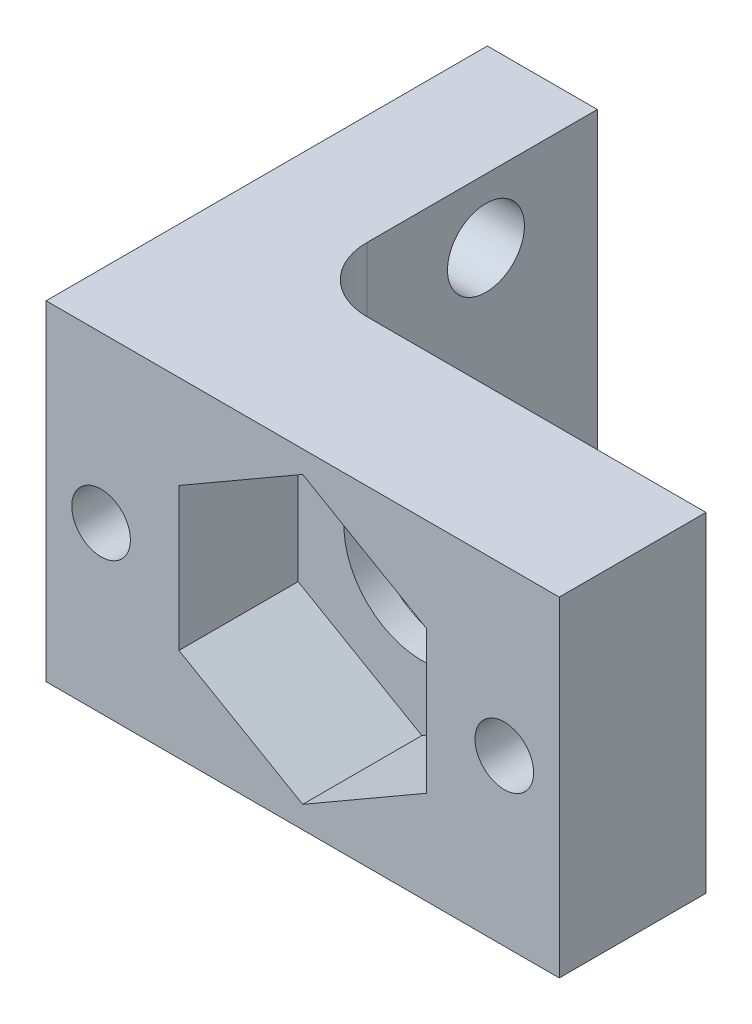
ISO-10303-21;
HEADER;
FILE_DESCRIPTION(('STEP AP214'),'2;1');
FILE_NAME('part.step','',(''),(''),'','','');
FILE_SCHEMA(('AUTOMOTIVE_DESIGN { 1 0 10303 214 1 1 1 1 }'));
ENDSEC;
DATA;
#1=APPLICATION_CONTEXT('core data for automotive mechanical design processes');
#2=APPLICATION_PROTOCOL_DEFINITION('international standard','automotive_design',2000,#1);
#3=PRODUCT_CONTEXT('',#1,'mechanical');
#4=PRODUCT('Part','Part','',(#3));
#5=PRODUCT_RELATED_PRODUCT_CATEGORY('part','',(#4));
#6=PRODUCT_DEFINITION_FORMATION('','',#4);
#7=PRODUCT_DEFINITION_CONTEXT('part definition',#1,'design');
#8=PRODUCT_DEFINITION('design','',#6,#7);
#9=PRODUCT_DEFINITION_SHAPE('','',#8);
#10=(LENGTH_UNIT() NAMED_UNIT(*) SI_UNIT(.MILLI.,.METRE.));
#11=(NAMED_UNIT(*) PLANE_ANGLE_UNIT() SI_UNIT($,.RADIAN.));
#12=(NAMED_UNIT(*) SI_UNIT($,.STERADIAN.) SOLID_ANGLE_UNIT());
#13=UNCERTAINTY_MEASURE_WITH_UNIT(LENGTH_MEASURE(1.E-05),#10,'distance_accuracy_value','');
#14=(GEOMETRIC_REPRESENTATION_CONTEXT(3) GLOBAL_UNCERTAINTY_ASSIGNED_CONTEXT((#13)) GLOBAL_UNIT_ASSIGNED_CONTEXT((#10,
#11,#12)) REPRESENTATION_CONTEXT('',''));
#15=CARTESIAN_POINT('',(0.,0.,0.));
#16=DIRECTION('',(0.,0.,1.));
#17=DIRECTION('',(1.,0.,0.));
#18=AXIS2_PLACEMENT_3D('',#15,#16,#17);
#19=CARTESIAN_POINT('',(6.,18.,-24.0761904761905));
#20=DIRECTION('',(0.,0.,1.));
#21=DIRECTION('',(1.,0.,0.));
#22=AXIS2_PLACEMENT_3D('',#19,#20,#21);
#23=PLANE('',#22);
#24=DIRECTION('',(-1.,0.,0.));
#25=VECTOR('',#24,1.);
#26=CARTESIAN_POINT('',(6.,0.,-24.0761904761905));
#27=LINE('',#26,#25);
#28=CARTESIAN_POINT('',(6.,0.,-24.0761904761905));
#29=VERTEX_POINT('',#28);
#30=CARTESIAN_POINT('',(0.,0.,-24.0761904761905));
#31=VERTEX_POINT('',#30);
#32=EDGE_CURVE('E251',#29,#31,#27,.T.);
#33=ORIENTED_EDGE('',*,*,#32,.T.);
#34=DIRECTION('',(0.,-1.,0.));
#35=VECTOR('',#34,1.);
#36=CARTESIAN_POINT('',(0.,18.,-24.0761904761905));
#37=LINE('',#36,#35);
#38=CARTESIAN_POINT('',(0.,18.,-24.0761904761905));
#39=VERTEX_POINT('',#38);
#40=EDGE_CURVE('E299',#39,#31,#37,.T.);
#41=ORIENTED_EDGE('',*,*,#40,.F.);
#42=DIRECTION('',(-1.,0.,0.));
#43=VECTOR('',#42,1.);
#44=CARTESIAN_POINT('',(6.,18.,-24.0761904761905));
#45=LINE('',#44,#43);
#46=CARTESIAN_POINT('',(6.,18.,-24.0761904761905));
#47=VERTEX_POINT('',#46);
#48=EDGE_CURVE('E262',#47,#39,#45,.T.);
#49=ORIENTED_EDGE('',*,*,#48,.F.);
#50=DIRECTION('',(0.,-1.,0.));
#51=VECTOR('',#50,1.);
#52=CARTESIAN_POINT('',(6.,18.,-24.0761904761905));
#53=LINE('',#52,#51);
#54=EDGE_CURVE('E276',#47,#29,#53,.T.);
#55=ORIENTED_EDGE('',*,*,#54,.T.);
#56=EDGE_LOOP('',(#33,#41,#49,#55));
#57=FACE_BOUND('',#56,.T.);
#58=ADVANCED_FACE('F35',(#57),#23,.F.);
#59=CARTESIAN_POINT('',(0.,18.,-24.0761904761905));
#60=DIRECTION('',(1.,0.,0.));
#61=DIRECTION('',(0.,0.,-1.));
#62=AXIS2_PLACEMENT_3D('',#59,#60,#61);
#63=PLANE('',#62);
#64=CARTESIAN_POINT('',(0.,3.5,-18.));
#65=DIRECTION('',(1.,0.,0.));
#66=DIRECTION('',(0.,0.,1.));
#67=AXIS2_PLACEMENT_3D('',#64,#65,#66);
#68=CIRCLE('',#67,2.1);
#69=CARTESIAN_POINT('',(0.,3.5,-15.9));
#70=VERTEX_POINT('',#69);
#71=EDGE_CURVE('E424',#70,#70,#68,.T.);
#72=ORIENTED_EDGE('',*,*,#71,.T.);
#73=EDGE_LOOP('',(#72));
#74=FACE_BOUND('',#73,.T.);
#75=CARTESIAN_POINT('',(0.,14.5,-18.));
#76=DIRECTION('',(1.,0.,0.));
#77=DIRECTION('',(0.,0.,-1.));
#78=AXIS2_PLACEMENT_3D('',#75,#76,#77);
#79=CIRCLE('',#78,2.1);
#80=CARTESIAN_POINT('',(0.,14.5,-20.1));
#81=VERTEX_POINT('',#80);
#82=EDGE_CURVE('E432',#81,#81,#79,.T.);
#83=ORIENTED_EDGE('',*,*,#82,.T.);
#84=EDGE_LOOP('',(#83));
#85=FACE_BOUND('',#84,.T.);
#86=DIRECTION('',(0.,0.,1.));
#87=VECTOR('',#86,1.);
#88=CARTESIAN_POINT('',(0.,6.,-14.));
#89=LINE('',#88,#87);
#90=CARTESIAN_POINT('',(0.,6.,-14.));
#91=VERTEX_POINT('',#90);
#92=CARTESIAN_POINT('',(0.,6.,-12.));
#93=VERTEX_POINT('',#92);
#94=EDGE_CURVE('E192',#91,#93,#89,.T.);
#95=ORIENTED_EDGE('',*,*,#94,.F.);
#96=DIRECTION('',(0.,-1.,0.));
#97=VECTOR('',#96,1.);
#98=CARTESIAN_POINT('',(0.,12.,-14.));
#99=LINE('',#98,#97);
#100=CARTESIAN_POINT('',(0.,12.,-14.));
#101=VERTEX_POINT('',#100);
#102=EDGE_CURVE('E162',#101,#91,#99,.T.);
#103=ORIENTED_EDGE('',*,*,#102,.F.);
#104=DIRECTION('',(0.,0.,-1.));
#105=VECTOR('',#104,1.);
#106=CARTESIAN_POINT('',(0.,12.,-14.));
#107=LINE('',#106,#105);
#108=CARTESIAN_POINT('',(0.,12.,-12.));
#109=VERTEX_POINT('',#108);
#110=EDGE_CURVE('E180',#109,#101,#107,.T.);
#111=ORIENTED_EDGE('',*,*,#110,.F.);
#112=DIRECTION('',(0.,1.,0.));
#113=VECTOR('',#112,1.);
#114=CARTESIAN_POINT('',(0.,12.,-12.));
#115=LINE('',#114,#113);
#116=EDGE_CURVE('E183',#93,#109,#115,.T.);
#117=ORIENTED_EDGE('',*,*,#116,.F.);
#118=EDGE_LOOP('',(#95,#103,#111,#117));
#119=FACE_BOUND('',#118,.T.);
#120=DIRECTION('',(0.,0.,1.));
#121=VECTOR('',#120,1.);
#122=CARTESIAN_POINT('',(0.,0.,-24.0761904761905));
#123=LINE('',#122,#121);
#124=CARTESIAN_POINT('',(0.,0.,0.));
#125=VERTEX_POINT('',#124);
#126=EDGE_CURVE('E279',#31,#125,#123,.T.);
#127=ORIENTED_EDGE('',*,*,#126,.T.);
#128=DIRECTION('',(0.,-1.,0.));
#129=VECTOR('',#128,1.);
#130=CARTESIAN_POINT('',(0.,18.,0.));
#131=LINE('',#130,#129);
#132=CARTESIAN_POINT('',(0.,18.,0.));
#133=VERTEX_POINT('',#132);
#134=EDGE_CURVE('E296',#133,#125,#131,.T.);
#135=ORIENTED_EDGE('',*,*,#134,.F.);
#136=DIRECTION('',(0.,0.,1.));
#137=VECTOR('',#136,1.);
#138=CARTESIAN_POINT('',(0.,18.,-24.0761904761905));
#139=LINE('',#138,#137);
#140=EDGE_CURVE('E265',#39,#133,#139,.T.);
#141=ORIENTED_EDGE('',*,*,#140,.F.);
#142=ORIENTED_EDGE('',*,*,#40,.T.);
#143=EDGE_LOOP('',(#127,#135,#141,#142));
#144=FACE_BOUND('',#143,.T.);
#145=ADVANCED_FACE('F339',(#74,#85,#119,#144),#63,.F.);
#146=CARTESIAN_POINT('',(0.,18.,0.));
#147=DIRECTION('',(0.,0.,-1.));
#148=DIRECTION('',(-1.,0.,0.));
#149=AXIS2_PLACEMENT_3D('',#146,#147,#148);
#150=PLANE('',#149);
#151=CARTESIAN_POINT('',(3.,9.,0.));
#152=DIRECTION('',(0.,0.,1.));
#153=DIRECTION('',(1.,0.,0.));
#154=AXIS2_PLACEMENT_3D('',#151,#152,#153);
#155=CIRCLE('',#154,1.6);
#156=CARTESIAN_POINT('',(4.6,9.,0.));
#157=VERTEX_POINT('',#156);
#158=EDGE_CURVE('E206',#157,#157,#155,.T.);
#159=ORIENTED_EDGE('',*,*,#158,.F.);
#160=EDGE_LOOP('',(#159));
#161=FACE_BOUND('',#160,.T.);
#162=CARTESIAN_POINT('',(25.,9.,0.));
#163=DIRECTION('',(0.,0.,1.));
#164=DIRECTION('',(1.,0.,0.));
#165=AXIS2_PLACEMENT_3D('',#162,#163,#164);
#166=CIRCLE('',#165,1.6);
#167=CARTESIAN_POINT('',(26.6,9.,0.));
#168=VERTEX_POINT('',#167);
#169=EDGE_CURVE('E205',#168,#168,#166,.T.);
#170=ORIENTED_EDGE('',*,*,#169,.F.);
#171=EDGE_LOOP('',(#170));
#172=FACE_BOUND('',#171,.T.);
#173=DIRECTION('',(0.,1.,0.));
#174=VECTOR('',#173,1.);
#175=CARTESIAN_POINT('',(20.75,5.10288568297003,0.));
#176=LINE('',#175,#174);
#177=CARTESIAN_POINT('',(20.75,5.10288568297002,0.));
#178=VERTEX_POINT('',#177);
#179=CARTESIAN_POINT('',(20.75,12.89711431703,0.));
#180=VERTEX_POINT('',#179);
#181=EDGE_CURVE('E235',#178,#180,#176,.T.);
#182=ORIENTED_EDGE('',*,*,#181,.F.);
#183=DIRECTION('',(0.866025403784438,0.5,0.));
#184=VECTOR('',#183,1.);
#185=CARTESIAN_POINT('',(14.,1.20577136594005,0.));
#186=LINE('',#185,#184);
#187=CARTESIAN_POINT('',(14.,1.20577136594005,0.));
#188=VERTEX_POINT('',#187);
#189=EDGE_CURVE('E233',#188,#178,#186,.T.);
#190=ORIENTED_EDGE('',*,*,#189,.F.);
#191=DIRECTION('',(0.866025403784438,-0.5,0.));
#192=VECTOR('',#191,1.);
#193=CARTESIAN_POINT('',(7.25,5.10288568297003,0.));
#194=LINE('',#193,#192);
#195=CARTESIAN_POINT('',(7.25,5.10288568297003,0.));
#196=VERTEX_POINT('',#195);
#197=EDGE_CURVE('E217',#196,#188,#194,.T.);
#198=ORIENTED_EDGE('',*,*,#197,.F.);
#199=DIRECTION('',(0.,-1.,0.));
#200=VECTOR('',#199,1.);
#201=CARTESIAN_POINT('',(7.25,12.89711431703,0.));
#202=LINE('',#201,#200);
#203=CARTESIAN_POINT('',(7.25,12.89711431703,0.));
#204=VERTEX_POINT('',#203);
#205=EDGE_CURVE('E244',#204,#196,#202,.T.);
#206=ORIENTED_EDGE('',*,*,#205,.F.);
#207=DIRECTION('',(-0.866025403784439,-0.5,0.));
#208=VECTOR('',#207,1.);
#209=CARTESIAN_POINT('',(14.,16.79422863406,0.));
#210=LINE('',#209,#208);
#211=CARTESIAN_POINT('',(14.,16.79422863406,0.));
#212=VERTEX_POINT('',#211);
#213=EDGE_CURVE('E241',#212,#204,#210,.T.);
#214=ORIENTED_EDGE('',*,*,#213,.F.);
#215=DIRECTION('',(-0.866025403784438,0.5,0.));
#216=VECTOR('',#215,1.);
#217=CARTESIAN_POINT('',(20.75,12.89711431703,0.));
#218=LINE('',#217,#216);
#219=EDGE_CURVE('E238',#180,#212,#218,.T.);
#220=ORIENTED_EDGE('',*,*,#219,.F.);
#221=EDGE_LOOP('',(#182,#190,#198,#206,#214,#220));
#222=FACE_BOUND('',#221,.T.);
#223=DIRECTION('',(1.,0.,0.));
#224=VECTOR('',#223,1.);
#225=CARTESIAN_POINT('',(0.,0.,0.));
#226=LINE('',#225,#224);
#227=CARTESIAN_POINT('',(28.,0.,0.));
#228=VERTEX_POINT('',#227);
#229=EDGE_CURVE('E281',#125,#228,#226,.T.);
#230=ORIENTED_EDGE('',*,*,#229,.T.);
#231=DIRECTION('',(0.,-1.,0.));
#232=VECTOR('',#231,1.);
#233=CARTESIAN_POINT('',(28.,18.,0.));
#234=LINE('',#233,#232);
#235=CARTESIAN_POINT('',(28.,18.,0.));
#236=VERTEX_POINT('',#235);
#237=EDGE_CURVE('E293',#236,#228,#234,.T.);
#238=ORIENTED_EDGE('',*,*,#237,.F.);
#239=DIRECTION('',(1.,0.,0.));
#240=VECTOR('',#239,1.);
#241=CARTESIAN_POINT('',(0.,18.,0.));
#242=LINE('',#241,#240);
#243=EDGE_CURVE('E268',#133,#236,#242,.T.);
#244=ORIENTED_EDGE('',*,*,#243,.F.);
#245=ORIENTED_EDGE('',*,*,#134,.T.);
#246=EDGE_LOOP('',(#230,#238,#244,#245));
#247=FACE_BOUND('',#246,.T.);
#248=ADVANCED_FACE('F343',(#161,#172,#222,#247),#150,.F.);
#249=CARTESIAN_POINT('',(28.,18.,0.));
#250=DIRECTION('',(-1.,0.,0.));
#251=DIRECTION('',(0.,0.,1.));
#252=AXIS2_PLACEMENT_3D('',#249,#250,#251);
#253=PLANE('',#252);
#254=DIRECTION('',(0.,0.,-1.));
#255=VECTOR('',#254,1.);
#256=CARTESIAN_POINT('',(28.,0.,0.));
#257=LINE('',#256,#255);
#258=CARTESIAN_POINT('',(28.,0.,-8.));
#259=VERTEX_POINT('',#258);
#260=EDGE_CURVE('E283',#228,#259,#257,.T.);
#261=ORIENTED_EDGE('',*,*,#260,.T.);
#262=DIRECTION('',(0.,-1.,0.));
#263=VECTOR('',#262,1.);
#264=CARTESIAN_POINT('',(28.,18.,-8.));
#265=LINE('',#264,#263);
#266=CARTESIAN_POINT('',(28.,18.,-8.));
#267=VERTEX_POINT('',#266);
#268=EDGE_CURVE('E290',#267,#259,#265,.T.);
#269=ORIENTED_EDGE('',*,*,#268,.F.);
#270=DIRECTION('',(0.,0.,-1.));
#271=VECTOR('',#270,1.);
#272=CARTESIAN_POINT('',(28.,18.,0.));
#273=LINE('',#272,#271);
#274=EDGE_CURVE('E270',#236,#267,#273,.T.);
#275=ORIENTED_EDGE('',*,*,#274,.F.);
#276=ORIENTED_EDGE('',*,*,#237,.T.);
#277=EDGE_LOOP('',(#261,#269,#275,#276));
#278=FACE_BOUND('',#277,.T.);
#279=ADVANCED_FACE('F349',(#278),#253,.F.);
#280=CARTESIAN_POINT('',(28.,18.,-8.));
#281=DIRECTION('',(0.,0.,1.));
#282=DIRECTION('',(1.,0.,0.));
#283=AXIS2_PLACEMENT_3D('',#280,#281,#282);
#284=PLANE('',#283);
#285=CARTESIAN_POINT('',(14.,9.,-8.));
#286=DIRECTION('',(0.,0.,1.));
#287=DIRECTION('',(1.,0.,0.));
#288=AXIS2_PLACEMENT_3D('',#285,#286,#287);
#289=CIRCLE('',#288,4.25);
#290=CARTESIAN_POINT('',(18.25,9.,-8.));
#291=VERTEX_POINT('',#290);
#292=EDGE_CURVE('E186',#291,#291,#289,.T.);
#293=ORIENTED_EDGE('',*,*,#292,.T.);
#294=EDGE_LOOP('',(#293));
#295=FACE_BOUND('',#294,.T.);
#296=CARTESIAN_POINT('',(25.,9.,-8.));
#297=DIRECTION('',(0.,0.,1.));
#298=DIRECTION('',(1.,0.,0.));
#299=AXIS2_PLACEMENT_3D('',#296,#297,#298);
#300=CIRCLE('',#299,1.6);
#301=CARTESIAN_POINT('',(26.6,9.,-8.));
#302=VERTEX_POINT('',#301);
#303=EDGE_CURVE('E212',#302,#302,#300,.T.);
#304=ORIENTED_EDGE('',*,*,#303,.T.);
#305=EDGE_LOOP('',(#304));
#306=FACE_BOUND('',#305,.T.);
#307=DIRECTION('',(-1.,0.,0.));
#308=VECTOR('',#307,1.);
#309=CARTESIAN_POINT('',(28.,0.,-8.));
#310=LINE('',#309,#308);
#311=CARTESIAN_POINT('',(9.5,0.,-8.));
#312=VERTEX_POINT('',#311);
#313=EDGE_CURVE('E285',#259,#312,#310,.T.);
#314=ORIENTED_EDGE('',*,*,#313,.T.);
#315=DIRECTION('',(0.,-1.,0.));
#316=VECTOR('',#315,1.);
#317=CARTESIAN_POINT('',(9.5,18.,-8.));
#318=LINE('',#317,#316);
#319=CARTESIAN_POINT('',(9.5,18.,-8.));
#320=VERTEX_POINT('',#319);
#321=EDGE_CURVE('E50',#312,#320,#318,.F.);
#322=ORIENTED_EDGE('',*,*,#321,.T.);
#323=DIRECTION('',(-1.,0.,0.));
#324=VECTOR('',#323,1.);
#325=CARTESIAN_POINT('',(28.,18.,-8.));
#326=LINE('',#325,#324);
#327=EDGE_CURVE('E272',#267,#320,#326,.T.);
#328=ORIENTED_EDGE('',*,*,#327,.F.);
#329=ORIENTED_EDGE('',*,*,#268,.T.);
#330=EDGE_LOOP('',(#314,#322,#328,#329));
#331=FACE_BOUND('',#330,.T.);
#332=ADVANCED_FACE('F353',(#295,#306,#331),#284,.F.);
#333=CARTESIAN_POINT('',(6.,18.,-8.));
#334=DIRECTION('',(-1.,0.,0.));
#335=DIRECTION('',(0.,0.,1.));
#336=AXIS2_PLACEMENT_3D('',#333,#334,#335);
#337=PLANE('',#336);
#338=CARTESIAN_POINT('',(6.,3.5,-18.));
#339=DIRECTION('',(1.,0.,0.));
#340=DIRECTION('',(0.,0.,1.));
#341=AXIS2_PLACEMENT_3D('',#338,#339,#340);
#342=CIRCLE('',#341,2.1);
#343=CARTESIAN_POINT('',(6.,3.5,-15.9));
#344=VERTEX_POINT('',#343);
#345=EDGE_CURVE('E427',#344,#344,#342,.T.);
#346=ORIENTED_EDGE('',*,*,#345,.F.);
#347=EDGE_LOOP('',(#346));
#348=FACE_BOUND('',#347,.T.);
#349=CARTESIAN_POINT('',(6.,14.5,-18.));
#350=DIRECTION('',(1.,0.,0.));
#351=DIRECTION('',(0.,0.,-1.));
#352=AXIS2_PLACEMENT_3D('',#349,#350,#351);
#353=CIRCLE('',#352,2.1);
#354=CARTESIAN_POINT('',(6.,14.5,-20.1));
#355=VERTEX_POINT('',#354);
#356=EDGE_CURVE('E429',#355,#355,#353,.T.);
#357=ORIENTED_EDGE('',*,*,#356,.F.);
#358=EDGE_LOOP('',(#357));
#359=FACE_BOUND('',#358,.T.);
#360=DIRECTION('',(0.,0.,-1.));
#361=VECTOR('',#360,1.);
#362=CARTESIAN_POINT('',(6.,12.,-14.));
#363=LINE('',#362,#361);
#364=CARTESIAN_POINT('',(6.,12.,-12.));
#365=VERTEX_POINT('',#364);
#366=CARTESIAN_POINT('',(6.,12.,-14.));
#367=VERTEX_POINT('',#366);
#368=EDGE_CURVE('E167',#365,#367,#363,.T.);
#369=ORIENTED_EDGE('',*,*,#368,.T.);
#370=DIRECTION('',(0.,-1.,0.));
#371=VECTOR('',#370,1.);
#372=CARTESIAN_POINT('',(6.,12.,-14.));
#373=LINE('',#372,#371);
#374=CARTESIAN_POINT('',(6.,6.,-14.));
#375=VERTEX_POINT('',#374);
#376=EDGE_CURVE('E159',#367,#375,#373,.T.);
#377=ORIENTED_EDGE('',*,*,#376,.T.);
#378=DIRECTION('',(0.,0.,1.));
#379=VECTOR('',#378,1.);
#380=CARTESIAN_POINT('',(6.,6.,-14.));
#381=LINE('',#380,#379);
#382=CARTESIAN_POINT('',(6.,6.,-12.));
#383=VERTEX_POINT('',#382);
#384=EDGE_CURVE('E171',#375,#383,#381,.T.);
#385=ORIENTED_EDGE('',*,*,#384,.T.);
#386=DIRECTION('',(0.,1.,0.));
#387=VECTOR('',#386,1.);
#388=CARTESIAN_POINT('',(6.,12.,-12.));
#389=LINE('',#388,#387);
#390=EDGE_CURVE('E175',#383,#365,#389,.T.);
#391=ORIENTED_EDGE('',*,*,#390,.T.);
#392=EDGE_LOOP('',(#369,#377,#385,#391));
#393=FACE_BOUND('',#392,.T.);
#394=DIRECTION('',(0.,0.,-1.));
#395=VECTOR('',#394,1.);
#396=CARTESIAN_POINT('',(6.,18.,-8.));
#397=LINE('',#396,#395);
#398=CARTESIAN_POINT('',(6.,18.,-11.5));
#399=VERTEX_POINT('',#398);
#400=EDGE_CURVE('E274',#399,#47,#397,.T.);
#401=ORIENTED_EDGE('',*,*,#400,.F.);
#402=DIRECTION('',(0.,-1.,0.));
#403=VECTOR('',#402,1.);
#404=CARTESIAN_POINT('',(6.,0.,-11.5));
#405=LINE('',#404,#403);
#406=CARTESIAN_POINT('',(6.,0.,-11.5));
#407=VERTEX_POINT('',#406);
#408=EDGE_CURVE('E302',#399,#407,#405,.T.);
#409=ORIENTED_EDGE('',*,*,#408,.T.);
#410=DIRECTION('',(0.,0.,-1.));
#411=VECTOR('',#410,1.);
#412=CARTESIAN_POINT('',(6.,0.,-8.));
#413=LINE('',#412,#411);
#414=EDGE_CURVE('E266',#407,#29,#413,.T.);
#415=ORIENTED_EDGE('',*,*,#414,.T.);
#416=ORIENTED_EDGE('',*,*,#54,.F.);
#417=EDGE_LOOP('',(#401,#409,#415,#416));
#418=FACE_BOUND('',#417,.T.);
#419=ADVANCED_FACE('F177',(#348,#359,#393,#418),#337,.F.);
#420=CARTESIAN_POINT('',(0.,18.,0.));
#421=DIRECTION('',(0.,1.,0.));
#422=DIRECTION('',(0.,0.,1.));
#423=AXIS2_PLACEMENT_3D('',#420,#421,#422);
#424=PLANE('',#423);
#425=ORIENTED_EDGE('',*,*,#48,.T.);
#426=ORIENTED_EDGE('',*,*,#140,.T.);
#427=ORIENTED_EDGE('',*,*,#243,.T.);
#428=ORIENTED_EDGE('',*,*,#274,.T.);
#429=ORIENTED_EDGE('',*,*,#327,.T.);
#430=CARTESIAN_POINT('',(9.5,18.,-11.5));
#431=DIRECTION('',(0.,1.,0.));
#432=DIRECTION('',(0.,0.,1.));
#433=AXIS2_PLACEMENT_3D('',#430,#431,#432);
#434=CIRCLE('',#433,3.5);
#435=EDGE_CURVE('E11',#320,#399,#434,.F.);
#436=ORIENTED_EDGE('',*,*,#435,.T.);
#437=ORIENTED_EDGE('',*,*,#400,.T.);
#438=EDGE_LOOP('',(#425,#426,#427,#428,#429,#436,#437));
#439=FACE_BOUND('',#438,.T.);
#440=ADVANCED_FACE('F323',(#439),#424,.T.);
#441=CARTESIAN_POINT('',(0.,0.,0.));
#442=DIRECTION('',(0.,1.,0.));
#443=DIRECTION('',(0.,0.,1.));
#444=AXIS2_PLACEMENT_3D('',#441,#442,#443);
#445=PLANE('',#444);
#446=ORIENTED_EDGE('',*,*,#32,.F.);
#447=ORIENTED_EDGE('',*,*,#414,.F.);
#448=CARTESIAN_POINT('',(9.5,0.,-11.5));
#449=DIRECTION('',(0.,1.,0.));
#450=DIRECTION('',(0.,0.,1.));
#451=AXIS2_PLACEMENT_3D('',#448,#449,#450);
#452=CIRCLE('',#451,3.5);
#453=EDGE_CURVE('E43',#407,#312,#452,.T.);
#454=ORIENTED_EDGE('',*,*,#453,.T.);
#455=ORIENTED_EDGE('',*,*,#313,.F.);
#456=ORIENTED_EDGE('',*,*,#260,.F.);
#457=ORIENTED_EDGE('',*,*,#229,.F.);
#458=ORIENTED_EDGE('',*,*,#126,.F.);
#459=EDGE_LOOP('',(#446,#447,#454,#455,#456,#457,#458));
#460=FACE_BOUND('',#459,.T.);
#461=ADVANCED_FACE('F317',(#460),#445,.F.);
#462=CARTESIAN_POINT('',(14.,1.20577136594005,-6.5));
#463=DIRECTION('',(0.5,-0.866025403784438,0.));
#464=DIRECTION('',(0.866025403784439,0.5,0.));
#465=AXIS2_PLACEMENT_3D('',#462,#463,#464);
#466=PLANE('',#465);
#467=ORIENTED_EDGE('',*,*,#189,.T.);
#468=DIRECTION('',(0.,0.,1.));
#469=VECTOR('',#468,1.);
#470=CARTESIAN_POINT('',(20.75,5.10288568297003,-6.5));
#471=LINE('',#470,#469);
#472=CARTESIAN_POINT('',(20.75,5.10288568297003,-6.5));
#473=VERTEX_POINT('',#472);
#474=EDGE_CURVE('E232',#473,#178,#471,.T.);
#475=ORIENTED_EDGE('',*,*,#474,.F.);
#476=DIRECTION('',(0.866025403784438,0.5,0.));
#477=VECTOR('',#476,1.);
#478=CARTESIAN_POINT('',(14.,1.20577136594005,-6.5));
#479=LINE('',#478,#477);
#480=CARTESIAN_POINT('',(14.,1.20577136594005,-6.5));
#481=VERTEX_POINT('',#480);
#482=EDGE_CURVE('E213',#481,#473,#479,.T.);
#483=ORIENTED_EDGE('',*,*,#482,.F.);
#484=DIRECTION('',(0.,0.,1.));
#485=VECTOR('',#484,1.);
#486=CARTESIAN_POINT('',(14.,1.20577136594005,-6.5));
#487=LINE('',#486,#485);
#488=EDGE_CURVE('E249',#481,#188,#487,.T.);
#489=ORIENTED_EDGE('',*,*,#488,.T.);
#490=EDGE_LOOP('',(#467,#475,#483,#489));
#491=FACE_BOUND('',#490,.T.);
#492=ADVANCED_FACE('F363',(#491),#466,.F.);
#493=CARTESIAN_POINT('',(7.25,5.10288568297003,-6.5));
#494=DIRECTION('',(-0.5,-0.866025403784438,0.));
#495=DIRECTION('',(0.866025403784438,-0.5,0.));
#496=AXIS2_PLACEMENT_3D('',#493,#494,#495);
#497=PLANE('',#496);
#498=ORIENTED_EDGE('',*,*,#197,.T.);
#499=ORIENTED_EDGE('',*,*,#488,.F.);
#500=DIRECTION('',(0.866025403784438,-0.5,0.));
#501=VECTOR('',#500,1.);
#502=CARTESIAN_POINT('',(7.25,5.10288568297003,-6.5));
#503=LINE('',#502,#501);
#504=CARTESIAN_POINT('',(7.25,5.10288568297003,-6.5));
#505=VERTEX_POINT('',#504);
#506=EDGE_CURVE('E229',#505,#481,#503,.T.);
#507=ORIENTED_EDGE('',*,*,#506,.F.);
#508=DIRECTION('',(0.,0.,1.));
#509=VECTOR('',#508,1.);
#510=CARTESIAN_POINT('',(7.25,5.10288568297003,-6.5));
#511=LINE('',#510,#509);
#512=EDGE_CURVE('E252',#505,#196,#511,.T.);
#513=ORIENTED_EDGE('',*,*,#512,.T.);
#514=EDGE_LOOP('',(#498,#499,#507,#513));
#515=FACE_BOUND('',#514,.T.);
#516=ADVANCED_FACE('F368',(#515),#497,.F.);
#517=CARTESIAN_POINT('',(7.25,12.89711431703,-6.5));
#518=DIRECTION('',(-1.,0.,0.));
#519=DIRECTION('',(0.,-1.,0.));
#520=AXIS2_PLACEMENT_3D('',#517,#518,#519);
#521=PLANE('',#520);
#522=ORIENTED_EDGE('',*,*,#205,.T.);
#523=ORIENTED_EDGE('',*,*,#512,.F.);
#524=DIRECTION('',(0.,-1.,0.));
#525=VECTOR('',#524,1.);
#526=CARTESIAN_POINT('',(7.25,12.89711431703,-6.5));
#527=LINE('',#526,#525);
#528=CARTESIAN_POINT('',(7.25,12.89711431703,-6.5));
#529=VERTEX_POINT('',#528);
#530=EDGE_CURVE('E226',#529,#505,#527,.T.);
#531=ORIENTED_EDGE('',*,*,#530,.F.);
#532=DIRECTION('',(0.,0.,1.));
#533=VECTOR('',#532,1.);
#534=CARTESIAN_POINT('',(7.25,12.89711431703,-6.5));
#535=LINE('',#534,#533);
#536=EDGE_CURVE('E254',#529,#204,#535,.T.);
#537=ORIENTED_EDGE('',*,*,#536,.T.);
#538=EDGE_LOOP('',(#522,#523,#531,#537));
#539=FACE_BOUND('',#538,.T.);
#540=ADVANCED_FACE('F382',(#539),#521,.F.);
#541=CARTESIAN_POINT('',(14.,16.79422863406,-6.5));
#542=DIRECTION('',(-0.5,0.866025403784439,0.));
#543=DIRECTION('',(-0.866025403784439,-0.5,0.));
#544=AXIS2_PLACEMENT_3D('',#541,#542,#543);
#545=PLANE('',#544);
#546=ORIENTED_EDGE('',*,*,#213,.T.);
#547=ORIENTED_EDGE('',*,*,#536,.F.);
#548=DIRECTION('',(-0.866025403784439,-0.5,0.));
#549=VECTOR('',#548,1.);
#550=CARTESIAN_POINT('',(14.,16.79422863406,-6.5));
#551=LINE('',#550,#549);
#552=CARTESIAN_POINT('',(14.,16.79422863406,-6.5));
#553=VERTEX_POINT('',#552);
#554=EDGE_CURVE('E223',#553,#529,#551,.T.);
#555=ORIENTED_EDGE('',*,*,#554,.F.);
#556=DIRECTION('',(0.,0.,1.));
#557=VECTOR('',#556,1.);
#558=CARTESIAN_POINT('',(14.,16.79422863406,-6.5));
#559=LINE('',#558,#557);
#560=EDGE_CURVE('E256',#553,#212,#559,.T.);
#561=ORIENTED_EDGE('',*,*,#560,.T.);
#562=EDGE_LOOP('',(#546,#547,#555,#561));
#563=FACE_BOUND('',#562,.T.);
#564=ADVANCED_FACE('F378',(#563),#545,.F.);
#565=CARTESIAN_POINT('',(20.75,12.89711431703,-6.5));
#566=DIRECTION('',(0.5,0.866025403784439,0.));
#567=DIRECTION('',(-0.866025403784439,0.5,0.));
#568=AXIS2_PLACEMENT_3D('',#565,#566,#567);
#569=PLANE('',#568);
#570=ORIENTED_EDGE('',*,*,#219,.T.);
#571=ORIENTED_EDGE('',*,*,#560,.F.);
#572=DIRECTION('',(-0.866025403784438,0.5,0.));
#573=VECTOR('',#572,1.);
#574=CARTESIAN_POINT('',(20.75,12.89711431703,-6.5));
#575=LINE('',#574,#573);
#576=CARTESIAN_POINT('',(20.75,12.89711431703,-6.5));
#577=VERTEX_POINT('',#576);
#578=EDGE_CURVE('E220',#577,#553,#575,.T.);
#579=ORIENTED_EDGE('',*,*,#578,.F.);
#580=DIRECTION('',(0.,0.,1.));
#581=VECTOR('',#580,1.);
#582=CARTESIAN_POINT('',(20.75,12.89711431703,-6.5));
#583=LINE('',#582,#581);
#584=EDGE_CURVE('E258',#577,#180,#583,.T.);
#585=ORIENTED_EDGE('',*,*,#584,.T.);
#586=EDGE_LOOP('',(#570,#571,#579,#585));
#587=FACE_BOUND('',#586,.T.);
#588=ADVANCED_FACE('F374',(#587),#569,.F.);
#589=CARTESIAN_POINT('',(20.75,5.10288568297003,-6.5));
#590=DIRECTION('',(1.,0.,0.));
#591=DIRECTION('',(0.,1.,0.));
#592=AXIS2_PLACEMENT_3D('',#589,#590,#591);
#593=PLANE('',#592);
#594=ORIENTED_EDGE('',*,*,#181,.T.);
#595=ORIENTED_EDGE('',*,*,#584,.F.);
#596=DIRECTION('',(0.,1.,0.));
#597=VECTOR('',#596,1.);
#598=CARTESIAN_POINT('',(20.75,5.10288568297003,-6.5));
#599=LINE('',#598,#597);
#600=EDGE_CURVE('E216',#473,#577,#599,.T.);
#601=ORIENTED_EDGE('',*,*,#600,.F.);
#602=ORIENTED_EDGE('',*,*,#474,.T.);
#603=EDGE_LOOP('',(#594,#595,#601,#602));
#604=FACE_BOUND('',#603,.T.);
#605=ADVANCED_FACE('F370',(#604),#593,.F.);
#606=CARTESIAN_POINT('',(0.,0.,-6.5));
#607=DIRECTION('',(0.,0.,1.));
#608=DIRECTION('',(1.,0.,0.));
#609=AXIS2_PLACEMENT_3D('',#606,#607,#608);
#610=PLANE('',#609);
#611=CARTESIAN_POINT('',(14.,9.,-6.5));
#612=DIRECTION('',(0.,0.,1.));
#613=DIRECTION('',(1.,0.,0.));
#614=AXIS2_PLACEMENT_3D('',#611,#612,#613);
#615=CIRCLE('',#614,4.25);
#616=CARTESIAN_POINT('',(18.25,9.,-6.5));
#617=VERTEX_POINT('',#616);
#618=EDGE_CURVE('E435',#617,#617,#615,.T.);
#619=ORIENTED_EDGE('',*,*,#618,.F.);
#620=EDGE_LOOP('',(#619));
#621=FACE_BOUND('',#620,.T.);
#622=ORIENTED_EDGE('',*,*,#482,.T.);
#623=ORIENTED_EDGE('',*,*,#600,.T.);
#624=ORIENTED_EDGE('',*,*,#578,.T.);
#625=ORIENTED_EDGE('',*,*,#554,.T.);
#626=ORIENTED_EDGE('',*,*,#530,.T.);
#627=ORIENTED_EDGE('',*,*,#506,.T.);
#628=EDGE_LOOP('',(#622,#623,#624,#625,#626,#627));
#629=FACE_BOUND('',#628,.T.);
#630=ADVANCED_FACE('F373',(#621,#629),#610,.T.);
#631=CARTESIAN_POINT('',(25.,9.,-17.));
#632=DIRECTION('',(0.,0.,1.));
#633=DIRECTION('',(1.,0.,0.));
#634=AXIS2_PLACEMENT_3D('',#631,#632,#633);
#635=CYLINDRICAL_SURFACE('',#634,1.6);
#636=ORIENTED_EDGE('',*,*,#169,.T.);
#637=EDGE_LOOP('',(#636));
#638=FACE_BOUND('',#637,.T.);
#639=ORIENTED_EDGE('',*,*,#303,.F.);
#640=EDGE_LOOP('',(#639));
#641=FACE_BOUND('',#640,.T.);
#642=ADVANCED_FACE('F392',(#638,#641),#635,.F.);
#643=CARTESIAN_POINT('',(3.,9.,-17.));
#644=DIRECTION('',(0.,0.,1.));
#645=DIRECTION('',(1.,0.,0.));
#646=AXIS2_PLACEMENT_3D('',#643,#644,#645);
#647=CYLINDRICAL_SURFACE('',#646,1.6);
#648=CARTESIAN_POINT('',(3.,9.,-12.));
#649=DIRECTION('',(0.,0.,1.));
#650=DIRECTION('',(1.,0.,0.));
#651=AXIS2_PLACEMENT_3D('',#648,#649,#650);
#652=CIRCLE('',#651,1.6);
#653=CARTESIAN_POINT('',(4.6,9.,-12.));
#654=VERTEX_POINT('',#653);
#655=EDGE_CURVE('E198',#654,#654,#652,.F.);
#656=ORIENTED_EDGE('',*,*,#655,.T.);
#657=EDGE_LOOP('',(#656));
#658=FACE_BOUND('',#657,.T.);
#659=ORIENTED_EDGE('',*,*,#158,.T.);
#660=EDGE_LOOP('',(#659));
#661=FACE_BOUND('',#660,.T.);
#662=ADVANCED_FACE('F396',(#658,#661),#647,.F.);
#663=CARTESIAN_POINT('',(6.,12.,-14.));
#664=DIRECTION('',(0.,0.,-1.));
#665=DIRECTION('',(-1.,0.,0.));
#666=AXIS2_PLACEMENT_3D('',#663,#664,#665);
#667=PLANE('',#666);
#668=ORIENTED_EDGE('',*,*,#102,.T.);
#669=DIRECTION('',(-1.,0.,0.));
#670=VECTOR('',#669,1.);
#671=CARTESIAN_POINT('',(6.,6.,-14.));
#672=LINE('',#671,#670);
#673=EDGE_CURVE('E154',#375,#91,#672,.T.);
#674=ORIENTED_EDGE('',*,*,#673,.F.);
#675=ORIENTED_EDGE('',*,*,#376,.F.);
#676=DIRECTION('',(-1.,0.,0.));
#677=VECTOR('',#676,1.);
#678=CARTESIAN_POINT('',(6.,12.,-14.));
#679=LINE('',#678,#677);
#680=EDGE_CURVE('E196',#367,#101,#679,.T.);
#681=ORIENTED_EDGE('',*,*,#680,.T.);
#682=EDGE_LOOP('',(#668,#674,#675,#681));
#683=FACE_BOUND('',#682,.T.);
#684=CARTESIAN_POINT('',(3.,9.,-14.));
#685=DIRECTION('',(0.,0.,-1.));
#686=DIRECTION('',(-1.,0.,0.));
#687=AXIS2_PLACEMENT_3D('',#684,#685,#686);
#688=CIRCLE('',#687,1.6);
#689=CARTESIAN_POINT('',(1.4,9.,-14.));
#690=VERTEX_POINT('',#689);
#691=EDGE_CURVE('E209',#690,#690,#688,.F.);
#692=ORIENTED_EDGE('',*,*,#691,.F.);
#693=EDGE_LOOP('',(#692));
#694=FACE_BOUND('',#693,.T.);
#695=ADVANCED_FACE('F156',(#683,#694),#667,.F.);
#696=CARTESIAN_POINT('',(6.,12.,-12.));
#697=DIRECTION('',(0.,0.,1.));
#698=DIRECTION('',(1.,0.,0.));
#699=AXIS2_PLACEMENT_3D('',#696,#697,#698);
#700=PLANE('',#699);
#701=ORIENTED_EDGE('',*,*,#116,.T.);
#702=DIRECTION('',(-1.,0.,0.));
#703=VECTOR('',#702,1.);
#704=CARTESIAN_POINT('',(6.,12.,-12.));
#705=LINE('',#704,#703);
#706=EDGE_CURVE('E199',#365,#109,#705,.T.);
#707=ORIENTED_EDGE('',*,*,#706,.F.);
#708=ORIENTED_EDGE('',*,*,#390,.F.);
#709=DIRECTION('',(-1.,0.,0.));
#710=VECTOR('',#709,1.);
#711=CARTESIAN_POINT('',(6.,6.,-12.));
#712=LINE('',#711,#710);
#713=EDGE_CURVE('E166',#383,#93,#712,.T.);
#714=ORIENTED_EDGE('',*,*,#713,.T.);
#715=EDGE_LOOP('',(#701,#707,#708,#714));
#716=FACE_BOUND('',#715,.T.);
#717=ORIENTED_EDGE('',*,*,#655,.F.);
#718=EDGE_LOOP('',(#717));
#719=FACE_BOUND('',#718,.T.);
#720=ADVANCED_FACE('F407',(#716,#719),#700,.F.);
#721=CARTESIAN_POINT('',(6.,12.,-14.));
#722=DIRECTION('',(0.,1.,0.));
#723=DIRECTION('',(0.,0.,1.));
#724=AXIS2_PLACEMENT_3D('',#721,#722,#723);
#725=PLANE('',#724);
#726=ORIENTED_EDGE('',*,*,#110,.T.);
#727=ORIENTED_EDGE('',*,*,#680,.F.);
#728=ORIENTED_EDGE('',*,*,#368,.F.);
#729=ORIENTED_EDGE('',*,*,#706,.T.);
#730=EDGE_LOOP('',(#726,#727,#728,#729));
#731=FACE_BOUND('',#730,.T.);
#732=ADVANCED_FACE('F410',(#731),#725,.F.);
#733=CARTESIAN_POINT('',(6.,6.,-14.));
#734=DIRECTION('',(0.,-1.,0.));
#735=DIRECTION('',(0.,0.,-1.));
#736=AXIS2_PLACEMENT_3D('',#733,#734,#735);
#737=PLANE('',#736);
#738=ORIENTED_EDGE('',*,*,#94,.T.);
#739=ORIENTED_EDGE('',*,*,#713,.F.);
#740=ORIENTED_EDGE('',*,*,#384,.F.);
#741=ORIENTED_EDGE('',*,*,#673,.T.);
#742=EDGE_LOOP('',(#738,#739,#740,#741));
#743=FACE_BOUND('',#742,.T.);
#744=ADVANCED_FACE('F172',(#743),#737,.F.);
#745=CARTESIAN_POINT('',(3.,9.,-17.));
#746=DIRECTION('',(0.,0.,1.));
#747=DIRECTION('',(1.,0.,0.));
#748=AXIS2_PLACEMENT_3D('',#745,#746,#747);
#749=PLANE('',#748);
#750=CARTESIAN_POINT('',(3.,9.,-17.));
#751=DIRECTION('',(0.,0.,1.));
#752=DIRECTION('',(1.,0.,0.));
#753=AXIS2_PLACEMENT_3D('',#750,#751,#752);
#754=CIRCLE('',#753,1.6);
#755=CARTESIAN_POINT('',(4.6,9.,-17.));
#756=VERTEX_POINT('',#755);
#757=EDGE_CURVE('E202',#756,#756,#754,.T.);
#758=ORIENTED_EDGE('',*,*,#757,.T.);
#759=EDGE_LOOP('',(#758));
#760=FACE_BOUND('',#759,.T.);
#761=ADVANCED_FACE('F401',(#760),#749,.T.);
#762=ORIENTED_EDGE('',*,*,#691,.T.);
#763=EDGE_LOOP('',(#762));
#764=FACE_BOUND('',#763,.T.);
#765=ORIENTED_EDGE('',*,*,#757,.F.);
#766=EDGE_LOOP('',(#765));
#767=FACE_BOUND('',#766,.T.);
#768=ADVANCED_FACE('F335',(#764,#767),#647,.F.);
#769=CARTESIAN_POINT('',(14.,9.,-12.5));
#770=DIRECTION('',(0.,0.,1.));
#771=DIRECTION('',(1.,0.,0.));
#772=AXIS2_PLACEMENT_3D('',#769,#770,#771);
#773=CYLINDRICAL_SURFACE('',#772,4.25);
#774=ORIENTED_EDGE('',*,*,#618,.T.);
#775=EDGE_LOOP('',(#774));
#776=FACE_BOUND('',#775,.T.);
#777=ORIENTED_EDGE('',*,*,#292,.F.);
#778=EDGE_LOOP('',(#777));
#779=FACE_BOUND('',#778,.T.);
#780=ADVANCED_FACE('F327',(#776,#779),#773,.F.);
#781=CARTESIAN_POINT('',(9.5,18.,-11.5));
#782=DIRECTION('',(0.,1.,0.));
#783=DIRECTION('',(0.,0.,1.));
#784=AXIS2_PLACEMENT_3D('',#781,#782,#783);
#785=CYLINDRICAL_SURFACE('',#784,3.5);
#786=ORIENTED_EDGE('',*,*,#435,.F.);
#787=ORIENTED_EDGE('',*,*,#321,.F.);
#788=ORIENTED_EDGE('',*,*,#453,.F.);
#789=ORIENTED_EDGE('',*,*,#408,.F.);
#790=EDGE_LOOP('',(#786,#787,#788,#789));
#791=FACE_BOUND('',#790,.T.);
#792=ADVANCED_FACE('F37',(#791),#785,.F.);
#793=CARTESIAN_POINT('',(0.,14.5,-18.));
#794=DIRECTION('',(1.,0.,0.));
#795=DIRECTION('',(0.,0.,-1.));
#796=AXIS2_PLACEMENT_3D('',#793,#794,#795);
#797=CYLINDRICAL_SURFACE('',#796,2.1);
#798=ORIENTED_EDGE('',*,*,#82,.F.);
#799=EDGE_LOOP('',(#798));
#800=FACE_BOUND('',#799,.T.);
#801=ORIENTED_EDGE('',*,*,#356,.T.);
#802=EDGE_LOOP('',(#801));
#803=FACE_BOUND('',#802,.T.);
#804=ADVANCED_FACE('F326',(#800,#803),#797,.F.);
#805=CARTESIAN_POINT('',(0.,3.5,-18.));
#806=DIRECTION('',(1.,0.,0.));
#807=DIRECTION('',(0.,0.,-1.));
#808=AXIS2_PLACEMENT_3D('',#805,#806,#807);
#809=CYLINDRICAL_SURFACE('',#808,2.1);
#810=ORIENTED_EDGE('',*,*,#71,.F.);
#811=EDGE_LOOP('',(#810));
#812=FACE_BOUND('',#811,.T.);
#813=ORIENTED_EDGE('',*,*,#345,.T.);
#814=EDGE_LOOP('',(#813));
#815=FACE_BOUND('',#814,.T.);
#816=ADVANCED_FACE('F332',(#812,#815),#809,.F.);
#817=CLOSED_SHELL('',(#58,#145,#248,#279,#332,#419,#440,#461,#492,#516,#540,#564,#588,#605,#630,
#642,#662,#695,#720,#732,#744,#761,#768,#780,#792,#804,#816));
#818=MANIFOLD_SOLID_BREP('B2',#817);
#819=ADVANCED_BREP_SHAPE_REPRESENTATION('',(#18,#818),#14);
#820=SHAPE_DEFINITION_REPRESENTATION(#9,#819);
ENDSEC;
END-ISO-10303-21;
